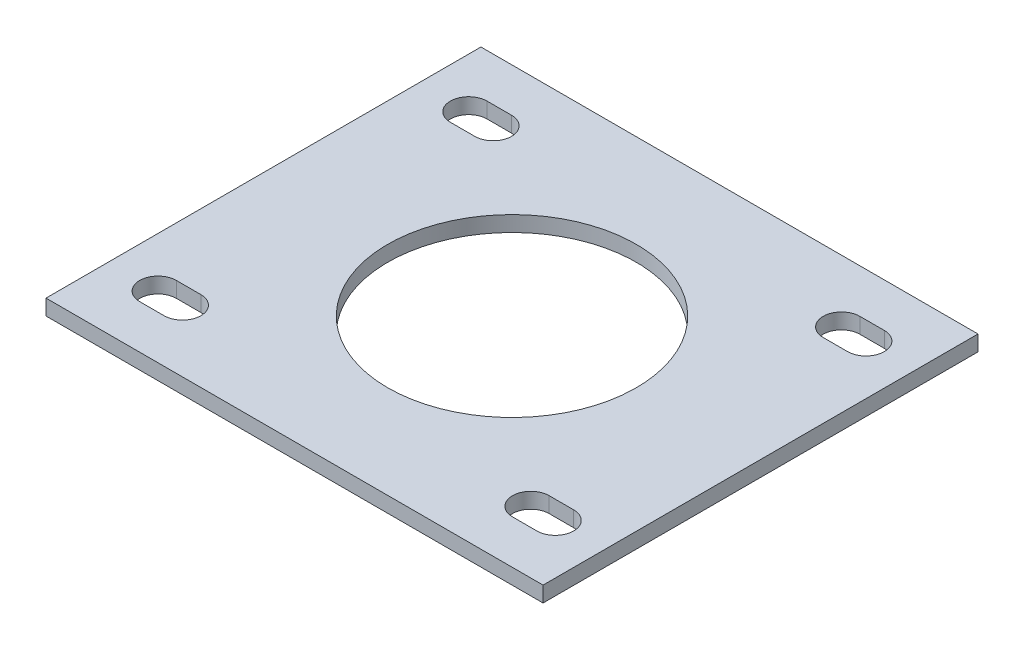
ISO-10303-21;
HEADER;
FILE_DESCRIPTION(('STEP AP214'),'2;1');
FILE_NAME('part.step','',(''),(''),'','','');
FILE_SCHEMA(('AUTOMOTIVE_DESIGN { 1 0 10303 214 1 1 1 1 }'));
ENDSEC;
DATA;
#1=APPLICATION_CONTEXT('core data for automotive mechanical design processes');
#2=APPLICATION_PROTOCOL_DEFINITION('international standard','automotive_design',2000,#1);
#3=PRODUCT_CONTEXT('',#1,'mechanical');
#4=PRODUCT('Part','Part','',(#3));
#5=PRODUCT_RELATED_PRODUCT_CATEGORY('part','',(#4));
#6=PRODUCT_DEFINITION_FORMATION('','',#4);
#7=PRODUCT_DEFINITION_CONTEXT('part definition',#1,'design');
#8=PRODUCT_DEFINITION('design','',#6,#7);
#9=PRODUCT_DEFINITION_SHAPE('','',#8);
#10=(LENGTH_UNIT() NAMED_UNIT(*) SI_UNIT(.MILLI.,.METRE.));
#11=(NAMED_UNIT(*) PLANE_ANGLE_UNIT() SI_UNIT($,.RADIAN.));
#12=(NAMED_UNIT(*) SI_UNIT($,.STERADIAN.) SOLID_ANGLE_UNIT());
#13=UNCERTAINTY_MEASURE_WITH_UNIT(LENGTH_MEASURE(1.E-05),#10,'distance_accuracy_value','');
#14=(GEOMETRIC_REPRESENTATION_CONTEXT(3) GLOBAL_UNCERTAINTY_ASSIGNED_CONTEXT((#13)) GLOBAL_UNIT_ASSIGNED_CONTEXT((#10,
#11,#12)) REPRESENTATION_CONTEXT('',''));
#15=CARTESIAN_POINT('',(0.,0.,0.));
#16=DIRECTION('',(0.,0.,1.));
#17=DIRECTION('',(1.,0.,0.));
#18=AXIS2_PLACEMENT_3D('',#15,#16,#17);
#19=CARTESIAN_POINT('',(0.,3.175,0.));
#20=DIRECTION('',(0.,1.,0.));
#21=DIRECTION('',(0.,0.,1.));
#22=AXIS2_PLACEMENT_3D('',#19,#20,#21);
#23=PLANE('',#22);
#24=CARTESIAN_POINT('',(-40.6,3.175,31.75));
#25=DIRECTION('',(0.,1.,0.));
#26=DIRECTION('',(0.,0.,1.));
#27=AXIS2_PLACEMENT_3D('',#24,#25,#26);
#28=CIRCLE('',#27,3.75);
#29=CARTESIAN_POINT('',(-40.6,3.175,28.));
#30=VERTEX_POINT('',#29);
#31=CARTESIAN_POINT('',(-40.6,3.175,35.5));
#32=VERTEX_POINT('',#31);
#33=EDGE_CURVE('E61',#30,#32,#28,.T.);
#34=ORIENTED_EDGE('',*,*,#33,.F.);
#35=DIRECTION('',(-1.,0.,0.));
#36=VECTOR('',#35,1.);
#37=CARTESIAN_POINT('',(-40.6,3.175,28.));
#38=LINE('',#37,#36);
#39=CARTESIAN_POINT('',(-35.6,3.175,28.));
#40=VERTEX_POINT('',#39);
#41=EDGE_CURVE('E246',#40,#30,#38,.T.);
#42=ORIENTED_EDGE('',*,*,#41,.F.);
#43=CARTESIAN_POINT('',(-35.6,3.175,31.75));
#44=DIRECTION('',(0.,1.,0.));
#45=DIRECTION('',(0.,0.,1.));
#46=AXIS2_PLACEMENT_3D('',#43,#44,#45);
#47=CIRCLE('',#46,3.75);
#48=CARTESIAN_POINT('',(-35.6,3.175,35.5));
#49=VERTEX_POINT('',#48);
#50=EDGE_CURVE('E250',#49,#40,#47,.T.);
#51=ORIENTED_EDGE('',*,*,#50,.F.);
#52=DIRECTION('',(1.,0.,0.));
#53=VECTOR('',#52,1.);
#54=CARTESIAN_POINT('',(-40.6,3.175,35.5));
#55=LINE('',#54,#53);
#56=EDGE_CURVE('E255',#32,#49,#55,.T.);
#57=ORIENTED_EDGE('',*,*,#56,.F.);
#58=EDGE_LOOP('',(#34,#42,#51,#57));
#59=FACE_BOUND('',#58,.T.);
#60=CARTESIAN_POINT('',(35.6,3.175,-31.75));
#61=DIRECTION('',(0.,1.,0.));
#62=DIRECTION('',(0.,0.,1.));
#63=AXIS2_PLACEMENT_3D('',#60,#61,#62);
#64=CIRCLE('',#63,3.75);
#65=CARTESIAN_POINT('',(35.6,3.175,-35.5));
#66=VERTEX_POINT('',#65);
#67=CARTESIAN_POINT('',(35.6,3.175,-28.));
#68=VERTEX_POINT('',#67);
#69=EDGE_CURVE('E69',#66,#68,#64,.T.);
#70=ORIENTED_EDGE('',*,*,#69,.F.);
#71=DIRECTION('',(-1.,0.,0.));
#72=VECTOR('',#71,1.);
#73=CARTESIAN_POINT('',(35.6,3.175,-35.5));
#74=LINE('',#73,#72);
#75=CARTESIAN_POINT('',(40.6,3.175,-35.5));
#76=VERTEX_POINT('',#75);
#77=EDGE_CURVE('E285',#76,#66,#74,.T.);
#78=ORIENTED_EDGE('',*,*,#77,.F.);
#79=CARTESIAN_POINT('',(40.6,3.175,-31.75));
#80=DIRECTION('',(0.,1.,0.));
#81=DIRECTION('',(0.,0.,1.));
#82=AXIS2_PLACEMENT_3D('',#79,#80,#81);
#83=CIRCLE('',#82,3.75);
#84=CARTESIAN_POINT('',(40.6,3.175,-28.));
#85=VERTEX_POINT('',#84);
#86=EDGE_CURVE('E289',#85,#76,#83,.T.);
#87=ORIENTED_EDGE('',*,*,#86,.F.);
#88=DIRECTION('',(1.,0.,0.));
#89=VECTOR('',#88,1.);
#90=CARTESIAN_POINT('',(35.6,3.175,-28.));
#91=LINE('',#90,#89);
#92=EDGE_CURVE('E294',#68,#85,#91,.T.);
#93=ORIENTED_EDGE('',*,*,#92,.F.);
#94=EDGE_LOOP('',(#70,#78,#87,#93));
#95=FACE_BOUND('',#94,.T.);
#96=CARTESIAN_POINT('',(35.6,3.175,31.75));
#97=DIRECTION('',(0.,1.,0.));
#98=DIRECTION('',(0.,0.,1.));
#99=AXIS2_PLACEMENT_3D('',#96,#97,#98);
#100=CIRCLE('',#99,3.75);
#101=CARTESIAN_POINT('',(35.6,3.175,28.));
#102=VERTEX_POINT('',#101);
#103=CARTESIAN_POINT('',(35.6,3.175,35.5));
#104=VERTEX_POINT('',#103);
#105=EDGE_CURVE('E186',#102,#104,#100,.T.);
#106=ORIENTED_EDGE('',*,*,#105,.F.);
#107=DIRECTION('',(-1.,0.,0.));
#108=VECTOR('',#107,1.);
#109=CARTESIAN_POINT('',(35.6,3.175,28.));
#110=LINE('',#109,#108);
#111=CARTESIAN_POINT('',(40.6,3.175,28.));
#112=VERTEX_POINT('',#111);
#113=EDGE_CURVE('E197',#112,#102,#110,.T.);
#114=ORIENTED_EDGE('',*,*,#113,.F.);
#115=CARTESIAN_POINT('',(40.6,3.175,31.75));
#116=DIRECTION('',(0.,1.,0.));
#117=DIRECTION('',(0.,0.,1.));
#118=AXIS2_PLACEMENT_3D('',#115,#116,#117);
#119=CIRCLE('',#118,3.75);
#120=CARTESIAN_POINT('',(40.6,3.175,35.5));
#121=VERTEX_POINT('',#120);
#122=EDGE_CURVE('E203',#121,#112,#119,.T.);
#123=ORIENTED_EDGE('',*,*,#122,.F.);
#124=DIRECTION('',(1.,0.,0.));
#125=VECTOR('',#124,1.);
#126=CARTESIAN_POINT('',(35.6,3.175,35.5));
#127=LINE('',#126,#125);
#128=EDGE_CURVE('E208',#104,#121,#127,.T.);
#129=ORIENTED_EDGE('',*,*,#128,.F.);
#130=EDGE_LOOP('',(#106,#114,#123,#129));
#131=FACE_BOUND('',#130,.T.);
#132=CARTESIAN_POINT('',(-40.6,3.175,-31.75));
#133=DIRECTION('',(0.,1.,0.));
#134=DIRECTION('',(0.,0.,1.));
#135=AXIS2_PLACEMENT_3D('',#132,#133,#134);
#136=CIRCLE('',#135,3.75000000000001);
#137=CARTESIAN_POINT('',(-40.6,3.175,-35.5));
#138=VERTEX_POINT('',#137);
#139=CARTESIAN_POINT('',(-40.6,3.175,-28.));
#140=VERTEX_POINT('',#139);
#141=EDGE_CURVE('E261',#138,#140,#136,.T.);
#142=ORIENTED_EDGE('',*,*,#141,.F.);
#143=DIRECTION('',(-1.,0.,0.));
#144=VECTOR('',#143,1.);
#145=CARTESIAN_POINT('',(-40.6,3.175,-35.5));
#146=LINE('',#145,#144);
#147=CARTESIAN_POINT('',(-35.6,3.175,-35.5));
#148=VERTEX_POINT('',#147);
#149=EDGE_CURVE('E319',#148,#138,#146,.T.);
#150=ORIENTED_EDGE('',*,*,#149,.F.);
#151=CARTESIAN_POINT('',(-35.6,3.175,-31.75));
#152=DIRECTION('',(0.,1.,0.));
#153=DIRECTION('',(0.,0.,1.));
#154=AXIS2_PLACEMENT_3D('',#151,#152,#153);
#155=CIRCLE('',#154,3.75000000000001);
#156=CARTESIAN_POINT('',(-35.6,3.175,-28.));
#157=VERTEX_POINT('',#156);
#158=EDGE_CURVE('E338',#157,#148,#155,.T.);
#159=ORIENTED_EDGE('',*,*,#158,.F.);
#160=DIRECTION('',(1.,0.,0.));
#161=VECTOR('',#160,1.);
#162=CARTESIAN_POINT('',(-40.6,3.175,-28.));
#163=LINE('',#162,#161);
#164=EDGE_CURVE('E334',#140,#157,#163,.T.);
#165=ORIENTED_EDGE('',*,*,#164,.F.);
#166=EDGE_LOOP('',(#142,#150,#159,#165));
#167=FACE_BOUND('',#166,.T.);
#168=DIRECTION('',(0.,0.,1.));
#169=VECTOR('',#168,1.);
#170=CARTESIAN_POINT('',(-50.8,3.175,44.45));
#171=LINE('',#170,#169);
#172=CARTESIAN_POINT('',(-50.8,3.175,-44.45));
#173=VERTEX_POINT('',#172);
#174=CARTESIAN_POINT('',(-50.8,3.175,44.45));
#175=VERTEX_POINT('',#174);
#176=EDGE_CURVE('E366',#173,#175,#171,.T.);
#177=ORIENTED_EDGE('',*,*,#176,.T.);
#178=DIRECTION('',(1.,0.,0.));
#179=VECTOR('',#178,1.);
#180=CARTESIAN_POINT('',(50.8,3.175,44.45));
#181=LINE('',#180,#179);
#182=CARTESIAN_POINT('',(50.8,3.175,44.45));
#183=VERTEX_POINT('',#182);
#184=EDGE_CURVE('E370',#175,#183,#181,.T.);
#185=ORIENTED_EDGE('',*,*,#184,.T.);
#186=DIRECTION('',(0.,0.,-1.));
#187=VECTOR('',#186,1.);
#188=CARTESIAN_POINT('',(50.8,3.175,44.45));
#189=LINE('',#188,#187);
#190=CARTESIAN_POINT('',(50.8,3.175,-44.45));
#191=VERTEX_POINT('',#190);
#192=EDGE_CURVE('E374',#183,#191,#189,.T.);
#193=ORIENTED_EDGE('',*,*,#192,.T.);
#194=DIRECTION('',(-1.,0.,0.));
#195=VECTOR('',#194,1.);
#196=CARTESIAN_POINT('',(50.8,3.175,-44.45));
#197=LINE('',#196,#195);
#198=EDGE_CURVE('E377',#191,#173,#197,.T.);
#199=ORIENTED_EDGE('',*,*,#198,.T.);
#200=EDGE_LOOP('',(#177,#185,#193,#199));
#201=FACE_BOUND('',#200,.T.);
#202=CARTESIAN_POINT('',(0.,3.175,0.));
#203=DIRECTION('',(0.,1.,0.));
#204=DIRECTION('',(0.,0.,1.));
#205=AXIS2_PLACEMENT_3D('',#202,#203,#204);
#206=CIRCLE('',#205,25.4);
#207=CARTESIAN_POINT('',(0.,3.175,25.4));
#208=VERTEX_POINT('',#207);
#209=EDGE_CURVE('E358',#208,#208,#206,.T.);
#210=ORIENTED_EDGE('',*,*,#209,.F.);
#211=EDGE_LOOP('',(#210));
#212=FACE_BOUND('',#211,.T.);
#213=ADVANCED_FACE('F45',(#59,#95,#131,#167,#201,#212),#23,.T.);
#214=CARTESIAN_POINT('',(0.,0.,0.));
#215=DIRECTION('',(0.,1.,0.));
#216=DIRECTION('',(0.,0.,1.));
#217=AXIS2_PLACEMENT_3D('',#214,#215,#216);
#218=PLANE('',#217);
#219=DIRECTION('',(-1.,0.,0.));
#220=VECTOR('',#219,1.);
#221=CARTESIAN_POINT('',(-40.6,0.,28.));
#222=LINE('',#221,#220);
#223=CARTESIAN_POINT('',(-35.6,0.,28.));
#224=VERTEX_POINT('',#223);
#225=CARTESIAN_POINT('',(-40.6,0.,28.));
#226=VERTEX_POINT('',#225);
#227=EDGE_CURVE('E236',#224,#226,#222,.T.);
#228=ORIENTED_EDGE('',*,*,#227,.T.);
#229=CARTESIAN_POINT('',(-40.6,0.,31.75));
#230=DIRECTION('',(0.,1.,0.));
#231=DIRECTION('',(0.,0.,1.));
#232=AXIS2_PLACEMENT_3D('',#229,#230,#231);
#233=CIRCLE('',#232,3.75);
#234=CARTESIAN_POINT('',(-40.6,0.,35.5));
#235=VERTEX_POINT('',#234);
#236=EDGE_CURVE('E251',#226,#235,#233,.T.);
#237=ORIENTED_EDGE('',*,*,#236,.T.);
#238=DIRECTION('',(1.,0.,0.));
#239=VECTOR('',#238,1.);
#240=CARTESIAN_POINT('',(-40.6,0.,35.5));
#241=LINE('',#240,#239);
#242=CARTESIAN_POINT('',(-35.6,0.,35.5));
#243=VERTEX_POINT('',#242);
#244=EDGE_CURVE('E269',#235,#243,#241,.T.);
#245=ORIENTED_EDGE('',*,*,#244,.T.);
#246=CARTESIAN_POINT('',(-35.6,0.,31.75));
#247=DIRECTION('',(0.,1.,0.));
#248=DIRECTION('',(0.,0.,1.));
#249=AXIS2_PLACEMENT_3D('',#246,#247,#248);
#250=CIRCLE('',#249,3.75);
#251=EDGE_CURVE('E265',#243,#224,#250,.T.);
#252=ORIENTED_EDGE('',*,*,#251,.T.);
#253=EDGE_LOOP('',(#228,#237,#245,#252));
#254=FACE_BOUND('',#253,.T.);
#255=DIRECTION('',(-1.,0.,0.));
#256=VECTOR('',#255,1.);
#257=CARTESIAN_POINT('',(35.6,0.,-35.5));
#258=LINE('',#257,#256);
#259=CARTESIAN_POINT('',(40.6,0.,-35.5));
#260=VERTEX_POINT('',#259);
#261=CARTESIAN_POINT('',(35.6,0.,-35.5));
#262=VERTEX_POINT('',#261);
#263=EDGE_CURVE('E279',#260,#262,#258,.T.);
#264=ORIENTED_EDGE('',*,*,#263,.T.);
#265=CARTESIAN_POINT('',(35.6,0.,-31.75));
#266=DIRECTION('',(0.,1.,0.));
#267=DIRECTION('',(0.,0.,1.));
#268=AXIS2_PLACEMENT_3D('',#265,#266,#267);
#269=CIRCLE('',#268,3.75);
#270=CARTESIAN_POINT('',(35.6,0.,-28.));
#271=VERTEX_POINT('',#270);
#272=EDGE_CURVE('E290',#262,#271,#269,.T.);
#273=ORIENTED_EDGE('',*,*,#272,.T.);
#274=DIRECTION('',(1.,0.,0.));
#275=VECTOR('',#274,1.);
#276=CARTESIAN_POINT('',(35.6,0.,-28.));
#277=LINE('',#276,#275);
#278=CARTESIAN_POINT('',(40.6,0.,-28.));
#279=VERTEX_POINT('',#278);
#280=EDGE_CURVE('E307',#271,#279,#277,.T.);
#281=ORIENTED_EDGE('',*,*,#280,.T.);
#282=CARTESIAN_POINT('',(40.6,0.,-31.75));
#283=DIRECTION('',(0.,1.,0.));
#284=DIRECTION('',(0.,0.,1.));
#285=AXIS2_PLACEMENT_3D('',#282,#283,#284);
#286=CIRCLE('',#285,3.75);
#287=EDGE_CURVE('E303',#279,#260,#286,.T.);
#288=ORIENTED_EDGE('',*,*,#287,.T.);
#289=EDGE_LOOP('',(#264,#273,#281,#288));
#290=FACE_BOUND('',#289,.T.);
#291=DIRECTION('',(-1.,0.,0.));
#292=VECTOR('',#291,1.);
#293=CARTESIAN_POINT('',(35.6,0.,28.));
#294=LINE('',#293,#292);
#295=CARTESIAN_POINT('',(40.6,0.,28.));
#296=VERTEX_POINT('',#295);
#297=CARTESIAN_POINT('',(35.6,0.,28.));
#298=VERTEX_POINT('',#297);
#299=EDGE_CURVE('E219',#296,#298,#294,.T.);
#300=ORIENTED_EDGE('',*,*,#299,.T.);
#301=CARTESIAN_POINT('',(35.6,0.,31.75));
#302=DIRECTION('',(0.,1.,0.));
#303=DIRECTION('',(0.,0.,1.));
#304=AXIS2_PLACEMENT_3D('',#301,#302,#303);
#305=CIRCLE('',#304,3.75);
#306=CARTESIAN_POINT('',(35.6,0.,35.5));
#307=VERTEX_POINT('',#306);
#308=EDGE_CURVE('E189',#298,#307,#305,.T.);
#309=ORIENTED_EDGE('',*,*,#308,.T.);
#310=DIRECTION('',(1.,0.,0.));
#311=VECTOR('',#310,1.);
#312=CARTESIAN_POINT('',(35.6,0.,35.5));
#313=LINE('',#312,#311);
#314=CARTESIAN_POINT('',(40.6,0.,35.5));
#315=VERTEX_POINT('',#314);
#316=EDGE_CURVE('E227',#307,#315,#313,.T.);
#317=ORIENTED_EDGE('',*,*,#316,.T.);
#318=CARTESIAN_POINT('',(40.6,0.,31.75));
#319=DIRECTION('',(0.,1.,0.));
#320=DIRECTION('',(0.,0.,1.));
#321=AXIS2_PLACEMENT_3D('',#318,#319,#320);
#322=CIRCLE('',#321,3.75);
#323=EDGE_CURVE('E222',#315,#296,#322,.T.);
#324=ORIENTED_EDGE('',*,*,#323,.T.);
#325=EDGE_LOOP('',(#300,#309,#317,#324));
#326=FACE_BOUND('',#325,.T.);
#327=DIRECTION('',(-1.,0.,0.));
#328=VECTOR('',#327,1.);
#329=CARTESIAN_POINT('',(-40.6,0.,-35.5));
#330=LINE('',#329,#328);
#331=CARTESIAN_POINT('',(-35.6,0.,-35.5));
#332=VERTEX_POINT('',#331);
#333=CARTESIAN_POINT('',(-40.6,0.,-35.5));
#334=VERTEX_POINT('',#333);
#335=EDGE_CURVE('E327',#332,#334,#330,.T.);
#336=ORIENTED_EDGE('',*,*,#335,.T.);
#337=CARTESIAN_POINT('',(-40.6,0.,-31.75));
#338=DIRECTION('',(0.,1.,0.));
#339=DIRECTION('',(0.,0.,1.));
#340=AXIS2_PLACEMENT_3D('',#337,#338,#339);
#341=CIRCLE('',#340,3.75000000000001);
#342=CARTESIAN_POINT('',(-40.6,0.,-28.));
#343=VERTEX_POINT('',#342);
#344=EDGE_CURVE('E314',#334,#343,#341,.T.);
#345=ORIENTED_EDGE('',*,*,#344,.T.);
#346=DIRECTION('',(1.,0.,0.));
#347=VECTOR('',#346,1.);
#348=CARTESIAN_POINT('',(-40.6,0.,-28.));
#349=LINE('',#348,#347);
#350=CARTESIAN_POINT('',(-35.6,0.,-28.));
#351=VERTEX_POINT('',#350);
#352=EDGE_CURVE('E318',#343,#351,#349,.T.);
#353=ORIENTED_EDGE('',*,*,#352,.T.);
#354=CARTESIAN_POINT('',(-35.6,0.,-31.75));
#355=DIRECTION('',(0.,1.,0.));
#356=DIRECTION('',(0.,0.,1.));
#357=AXIS2_PLACEMENT_3D('',#354,#355,#356);
#358=CIRCLE('',#357,3.75000000000001);
#359=EDGE_CURVE('E323',#351,#332,#358,.T.);
#360=ORIENTED_EDGE('',*,*,#359,.T.);
#361=EDGE_LOOP('',(#336,#345,#353,#360));
#362=FACE_BOUND('',#361,.T.);
#363=DIRECTION('',(0.,0.,1.));
#364=VECTOR('',#363,1.);
#365=CARTESIAN_POINT('',(-50.8,0.,44.45));
#366=LINE('',#365,#364);
#367=CARTESIAN_POINT('',(-50.8,0.,-44.45));
#368=VERTEX_POINT('',#367);
#369=CARTESIAN_POINT('',(-50.8,0.,44.45));
#370=VERTEX_POINT('',#369);
#371=EDGE_CURVE('E362',#368,#370,#366,.T.);
#372=ORIENTED_EDGE('',*,*,#371,.F.);
#373=DIRECTION('',(-1.,0.,0.));
#374=VECTOR('',#373,1.);
#375=CARTESIAN_POINT('',(50.8,0.,-44.45));
#376=LINE('',#375,#374);
#377=CARTESIAN_POINT('',(50.8,0.,-44.45));
#378=VERTEX_POINT('',#377);
#379=EDGE_CURVE('E371',#378,#368,#376,.T.);
#380=ORIENTED_EDGE('',*,*,#379,.F.);
#381=DIRECTION('',(0.,0.,-1.));
#382=VECTOR('',#381,1.);
#383=CARTESIAN_POINT('',(50.8,0.,44.45));
#384=LINE('',#383,#382);
#385=CARTESIAN_POINT('',(50.8,0.,44.45));
#386=VERTEX_POINT('',#385);
#387=EDGE_CURVE('E387',#386,#378,#384,.T.);
#388=ORIENTED_EDGE('',*,*,#387,.F.);
#389=DIRECTION('',(1.,0.,0.));
#390=VECTOR('',#389,1.);
#391=CARTESIAN_POINT('',(50.8,0.,44.45));
#392=LINE('',#391,#390);
#393=EDGE_CURVE('E384',#370,#386,#392,.T.);
#394=ORIENTED_EDGE('',*,*,#393,.F.);
#395=EDGE_LOOP('',(#372,#380,#388,#394));
#396=FACE_BOUND('',#395,.T.);
#397=CARTESIAN_POINT('',(0.,0.,0.));
#398=DIRECTION('',(0.,1.,0.));
#399=DIRECTION('',(0.,0.,1.));
#400=AXIS2_PLACEMENT_3D('',#397,#398,#399);
#401=CIRCLE('',#400,25.4);
#402=CARTESIAN_POINT('',(0.,0.,25.4));
#403=VERTEX_POINT('',#402);
#404=EDGE_CURVE('E348',#403,#403,#401,.T.);
#405=ORIENTED_EDGE('',*,*,#404,.T.);
#406=EDGE_LOOP('',(#405));
#407=FACE_BOUND('',#406,.T.);
#408=ADVANCED_FACE('F410',(#254,#290,#326,#362,#396,#407),#218,.F.);
#409=CARTESIAN_POINT('',(-50.8,3.175,44.45));
#410=DIRECTION('',(1.,0.,0.));
#411=DIRECTION('',(0.,0.,-1.));
#412=AXIS2_PLACEMENT_3D('',#409,#410,#411);
#413=PLANE('',#412);
#414=ORIENTED_EDGE('',*,*,#371,.T.);
#415=DIRECTION('',(0.,-1.,0.));
#416=VECTOR('',#415,1.);
#417=CARTESIAN_POINT('',(-50.8,3.175,44.45));
#418=LINE('',#417,#416);
#419=EDGE_CURVE('E11',#175,#370,#418,.T.);
#420=ORIENTED_EDGE('',*,*,#419,.F.);
#421=ORIENTED_EDGE('',*,*,#176,.F.);
#422=DIRECTION('',(0.,-1.,0.));
#423=VECTOR('',#422,1.);
#424=CARTESIAN_POINT('',(-50.8,3.175,-44.45));
#425=LINE('',#424,#423);
#426=EDGE_CURVE('E380',#173,#368,#425,.T.);
#427=ORIENTED_EDGE('',*,*,#426,.T.);
#428=EDGE_LOOP('',(#414,#420,#421,#427));
#429=FACE_BOUND('',#428,.T.);
#430=ADVANCED_FACE('F47',(#429),#413,.F.);
#431=CARTESIAN_POINT('',(50.8,3.175,44.45));
#432=DIRECTION('',(0.,0.,-1.));
#433=DIRECTION('',(-1.,0.,0.));
#434=AXIS2_PLACEMENT_3D('',#431,#432,#433);
#435=PLANE('',#434);
#436=ORIENTED_EDGE('',*,*,#393,.T.);
#437=DIRECTION('',(0.,-1.,0.));
#438=VECTOR('',#437,1.);
#439=CARTESIAN_POINT('',(50.8,3.175,44.45));
#440=LINE('',#439,#438);
#441=EDGE_CURVE('E54',#183,#386,#440,.T.);
#442=ORIENTED_EDGE('',*,*,#441,.F.);
#443=ORIENTED_EDGE('',*,*,#184,.F.);
#444=ORIENTED_EDGE('',*,*,#419,.T.);
#445=EDGE_LOOP('',(#436,#442,#443,#444));
#446=FACE_BOUND('',#445,.T.);
#447=ADVANCED_FACE('F421',(#446),#435,.F.);
#448=CARTESIAN_POINT('',(50.8,3.175,44.45));
#449=DIRECTION('',(-1.,0.,0.));
#450=DIRECTION('',(0.,0.,1.));
#451=AXIS2_PLACEMENT_3D('',#448,#449,#450);
#452=PLANE('',#451);
#453=ORIENTED_EDGE('',*,*,#387,.T.);
#454=DIRECTION('',(0.,-1.,0.));
#455=VECTOR('',#454,1.);
#456=CARTESIAN_POINT('',(50.8,3.175,-44.45));
#457=LINE('',#456,#455);
#458=EDGE_CURVE('E395',#191,#378,#457,.T.);
#459=ORIENTED_EDGE('',*,*,#458,.F.);
#460=ORIENTED_EDGE('',*,*,#192,.F.);
#461=ORIENTED_EDGE('',*,*,#441,.T.);
#462=EDGE_LOOP('',(#453,#459,#460,#461));
#463=FACE_BOUND('',#462,.T.);
#464=ADVANCED_FACE('F404',(#463),#452,.F.);
#465=CARTESIAN_POINT('',(50.8,3.175,-44.45));
#466=DIRECTION('',(0.,0.,1.));
#467=DIRECTION('',(1.,0.,0.));
#468=AXIS2_PLACEMENT_3D('',#465,#466,#467);
#469=PLANE('',#468);
#470=ORIENTED_EDGE('',*,*,#379,.T.);
#471=ORIENTED_EDGE('',*,*,#426,.F.);
#472=ORIENTED_EDGE('',*,*,#198,.F.);
#473=ORIENTED_EDGE('',*,*,#458,.T.);
#474=EDGE_LOOP('',(#470,#471,#472,#473));
#475=FACE_BOUND('',#474,.T.);
#476=ADVANCED_FACE('F414',(#475),#469,.F.);
#477=CARTESIAN_POINT('',(0.,3.175,0.));
#478=DIRECTION('',(0.,-1.,0.));
#479=DIRECTION('',(0.,0.,-1.));
#480=AXIS2_PLACEMENT_3D('',#477,#478,#479);
#481=CYLINDRICAL_SURFACE('',#480,25.4);
#482=ORIENTED_EDGE('',*,*,#209,.T.);
#483=EDGE_LOOP('',(#482));
#484=FACE_BOUND('',#483,.T.);
#485=ORIENTED_EDGE('',*,*,#404,.F.);
#486=EDGE_LOOP('',(#485));
#487=FACE_BOUND('',#486,.T.);
#488=ADVANCED_FACE('F439',(#484,#487),#481,.F.);
#489=CARTESIAN_POINT('',(-40.6,0.,-31.75));
#490=DIRECTION('',(0.,1.,0.));
#491=DIRECTION('',(0.,0.,1.));
#492=AXIS2_PLACEMENT_3D('',#489,#490,#491);
#493=CYLINDRICAL_SURFACE('',#492,3.75000000000001);
#494=ORIENTED_EDGE('',*,*,#141,.T.);
#495=DIRECTION('',(0.,1.,0.));
#496=VECTOR('',#495,1.);
#497=CARTESIAN_POINT('',(-40.6,0.,-28.));
#498=LINE('',#497,#496);
#499=EDGE_CURVE('E331',#343,#140,#498,.T.);
#500=ORIENTED_EDGE('',*,*,#499,.F.);
#501=ORIENTED_EDGE('',*,*,#344,.F.);
#502=DIRECTION('',(0.,1.,0.));
#503=VECTOR('',#502,1.);
#504=CARTESIAN_POINT('',(-40.6,0.,-35.5));
#505=LINE('',#504,#503);
#506=EDGE_CURVE('E345',#334,#138,#505,.T.);
#507=ORIENTED_EDGE('',*,*,#506,.T.);
#508=EDGE_LOOP('',(#494,#500,#501,#507));
#509=FACE_BOUND('',#508,.T.);
#510=ADVANCED_FACE('F445',(#509),#493,.F.);
#511=CARTESIAN_POINT('',(-40.6,0.,-35.5));
#512=DIRECTION('',(0.,0.,-1.));
#513=DIRECTION('',(-1.,0.,0.));
#514=AXIS2_PLACEMENT_3D('',#511,#512,#513);
#515=PLANE('',#514);
#516=ORIENTED_EDGE('',*,*,#149,.T.);
#517=ORIENTED_EDGE('',*,*,#506,.F.);
#518=ORIENTED_EDGE('',*,*,#335,.F.);
#519=DIRECTION('',(0.,1.,0.));
#520=VECTOR('',#519,1.);
#521=CARTESIAN_POINT('',(-35.6,0.,-35.5));
#522=LINE('',#521,#520);
#523=EDGE_CURVE('E349',#332,#148,#522,.T.);
#524=ORIENTED_EDGE('',*,*,#523,.T.);
#525=EDGE_LOOP('',(#516,#517,#518,#524));
#526=FACE_BOUND('',#525,.T.);
#527=ADVANCED_FACE('F450',(#526),#515,.F.);
#528=CARTESIAN_POINT('',(-35.6,0.,-31.75));
#529=DIRECTION('',(0.,1.,0.));
#530=DIRECTION('',(0.,0.,1.));
#531=AXIS2_PLACEMENT_3D('',#528,#529,#530);
#532=CYLINDRICAL_SURFACE('',#531,3.75000000000001);
#533=ORIENTED_EDGE('',*,*,#158,.T.);
#534=ORIENTED_EDGE('',*,*,#523,.F.);
#535=ORIENTED_EDGE('',*,*,#359,.F.);
#536=DIRECTION('',(0.,1.,0.));
#537=VECTOR('',#536,1.);
#538=CARTESIAN_POINT('',(-35.6,0.,-28.));
#539=LINE('',#538,#537);
#540=EDGE_CURVE('E352',#351,#157,#539,.T.);
#541=ORIENTED_EDGE('',*,*,#540,.T.);
#542=EDGE_LOOP('',(#533,#534,#535,#541));
#543=FACE_BOUND('',#542,.T.);
#544=ADVANCED_FACE('F458',(#543),#532,.F.);
#545=CARTESIAN_POINT('',(-40.6,0.,-28.));
#546=DIRECTION('',(0.,0.,1.));
#547=DIRECTION('',(1.,0.,0.));
#548=AXIS2_PLACEMENT_3D('',#545,#546,#547);
#549=PLANE('',#548);
#550=ORIENTED_EDGE('',*,*,#164,.T.);
#551=ORIENTED_EDGE('',*,*,#540,.F.);
#552=ORIENTED_EDGE('',*,*,#352,.F.);
#553=ORIENTED_EDGE('',*,*,#499,.T.);
#554=EDGE_LOOP('',(#550,#551,#552,#553));
#555=FACE_BOUND('',#554,.T.);
#556=ADVANCED_FACE('F462',(#555),#549,.F.);
#557=CARTESIAN_POINT('',(35.6,0.,31.75));
#558=DIRECTION('',(0.,1.,0.));
#559=DIRECTION('',(0.,0.,1.));
#560=AXIS2_PLACEMENT_3D('',#557,#558,#559);
#561=CYLINDRICAL_SURFACE('',#560,3.75);
#562=ORIENTED_EDGE('',*,*,#105,.T.);
#563=DIRECTION('',(0.,1.,0.));
#564=VECTOR('',#563,1.);
#565=CARTESIAN_POINT('',(35.6,0.,35.5));
#566=LINE('',#565,#564);
#567=EDGE_CURVE('E223',#307,#104,#566,.T.);
#568=ORIENTED_EDGE('',*,*,#567,.F.);
#569=ORIENTED_EDGE('',*,*,#308,.F.);
#570=DIRECTION('',(0.,1.,0.));
#571=VECTOR('',#570,1.);
#572=CARTESIAN_POINT('',(35.6,0.,28.));
#573=LINE('',#572,#571);
#574=EDGE_CURVE('E182',#298,#102,#573,.T.);
#575=ORIENTED_EDGE('',*,*,#574,.T.);
#576=EDGE_LOOP('',(#562,#568,#569,#575));
#577=FACE_BOUND('',#576,.T.);
#578=ADVANCED_FACE('F184',(#577),#561,.F.);
#579=CARTESIAN_POINT('',(35.6,0.,28.));
#580=DIRECTION('',(0.,0.,-1.));
#581=DIRECTION('',(-1.,0.,0.));
#582=AXIS2_PLACEMENT_3D('',#579,#580,#581);
#583=PLANE('',#582);
#584=ORIENTED_EDGE('',*,*,#113,.T.);
#585=ORIENTED_EDGE('',*,*,#574,.F.);
#586=ORIENTED_EDGE('',*,*,#299,.F.);
#587=DIRECTION('',(0.,1.,0.));
#588=VECTOR('',#587,1.);
#589=CARTESIAN_POINT('',(40.6,0.,28.));
#590=LINE('',#589,#588);
#591=EDGE_CURVE('E194',#296,#112,#590,.T.);
#592=ORIENTED_EDGE('',*,*,#591,.T.);
#593=EDGE_LOOP('',(#584,#585,#586,#592));
#594=FACE_BOUND('',#593,.T.);
#595=ADVANCED_FACE('F198',(#594),#583,.F.);
#596=CARTESIAN_POINT('',(40.6,0.,31.75));
#597=DIRECTION('',(0.,1.,0.));
#598=DIRECTION('',(0.,0.,1.));
#599=AXIS2_PLACEMENT_3D('',#596,#597,#598);
#600=CYLINDRICAL_SURFACE('',#599,3.75);
#601=ORIENTED_EDGE('',*,*,#122,.T.);
#602=ORIENTED_EDGE('',*,*,#591,.F.);
#603=ORIENTED_EDGE('',*,*,#323,.F.);
#604=DIRECTION('',(0.,1.,0.));
#605=VECTOR('',#604,1.);
#606=CARTESIAN_POINT('',(40.6,0.,35.5));
#607=LINE('',#606,#605);
#608=EDGE_CURVE('E640',#315,#121,#607,.T.);
#609=ORIENTED_EDGE('',*,*,#608,.T.);
#610=EDGE_LOOP('',(#601,#602,#603,#609));
#611=FACE_BOUND('',#610,.T.);
#612=ADVANCED_FACE('F502',(#611),#600,.F.);
#613=CARTESIAN_POINT('',(35.6,0.,35.5));
#614=DIRECTION('',(0.,0.,1.));
#615=DIRECTION('',(1.,0.,0.));
#616=AXIS2_PLACEMENT_3D('',#613,#614,#615);
#617=PLANE('',#616);
#618=ORIENTED_EDGE('',*,*,#128,.T.);
#619=ORIENTED_EDGE('',*,*,#608,.F.);
#620=ORIENTED_EDGE('',*,*,#316,.F.);
#621=ORIENTED_EDGE('',*,*,#567,.T.);
#622=EDGE_LOOP('',(#618,#619,#620,#621));
#623=FACE_BOUND('',#622,.T.);
#624=ADVANCED_FACE('F485',(#623),#617,.F.);
#625=CARTESIAN_POINT('',(35.6,0.,-31.75));
#626=DIRECTION('',(0.,1.,0.));
#627=DIRECTION('',(0.,0.,1.));
#628=AXIS2_PLACEMENT_3D('',#625,#626,#627);
#629=CYLINDRICAL_SURFACE('',#628,3.75);
#630=ORIENTED_EDGE('',*,*,#69,.T.);
#631=DIRECTION('',(0.,1.,0.));
#632=VECTOR('',#631,1.);
#633=CARTESIAN_POINT('',(35.6,0.,-28.));
#634=LINE('',#633,#632);
#635=EDGE_CURVE('E276',#271,#68,#634,.T.);
#636=ORIENTED_EDGE('',*,*,#635,.F.);
#637=ORIENTED_EDGE('',*,*,#272,.F.);
#638=DIRECTION('',(0.,1.,0.));
#639=VECTOR('',#638,1.);
#640=CARTESIAN_POINT('',(35.6,0.,-35.5));
#641=LINE('',#640,#639);
#642=EDGE_CURVE('E210',#262,#66,#641,.T.);
#643=ORIENTED_EDGE('',*,*,#642,.T.);
#644=EDGE_LOOP('',(#630,#636,#637,#643));
#645=FACE_BOUND('',#644,.T.);
#646=ADVANCED_FACE('F473',(#645),#629,.F.);
#647=CARTESIAN_POINT('',(35.6,0.,-35.5));
#648=DIRECTION('',(0.,0.,-1.));
#649=DIRECTION('',(-1.,0.,0.));
#650=AXIS2_PLACEMENT_3D('',#647,#648,#649);
#651=PLANE('',#650);
#652=ORIENTED_EDGE('',*,*,#77,.T.);
#653=ORIENTED_EDGE('',*,*,#642,.F.);
#654=ORIENTED_EDGE('',*,*,#263,.F.);
#655=DIRECTION('',(0.,1.,0.));
#656=VECTOR('',#655,1.);
#657=CARTESIAN_POINT('',(40.6,0.,-35.5));
#658=LINE('',#657,#656);
#659=EDGE_CURVE('E214',#260,#76,#658,.T.);
#660=ORIENTED_EDGE('',*,*,#659,.T.);
#661=EDGE_LOOP('',(#652,#653,#654,#660));
#662=FACE_BOUND('',#661,.T.);
#663=ADVANCED_FACE('F469',(#662),#651,.F.);
#664=CARTESIAN_POINT('',(40.6,0.,-31.75));
#665=DIRECTION('',(0.,1.,0.));
#666=DIRECTION('',(0.,0.,1.));
#667=AXIS2_PLACEMENT_3D('',#664,#665,#666);
#668=CYLINDRICAL_SURFACE('',#667,3.75);
#669=ORIENTED_EDGE('',*,*,#86,.T.);
#670=ORIENTED_EDGE('',*,*,#659,.F.);
#671=ORIENTED_EDGE('',*,*,#287,.F.);
#672=DIRECTION('',(0.,1.,0.));
#673=VECTOR('',#672,1.);
#674=CARTESIAN_POINT('',(40.6,0.,-28.));
#675=LINE('',#674,#673);
#676=EDGE_CURVE('E280',#279,#85,#675,.T.);
#677=ORIENTED_EDGE('',*,*,#676,.T.);
#678=EDGE_LOOP('',(#669,#670,#671,#677));
#679=FACE_BOUND('',#678,.T.);
#680=ADVANCED_FACE('F472',(#679),#668,.F.);
#681=CARTESIAN_POINT('',(35.6,0.,-28.));
#682=DIRECTION('',(0.,0.,1.));
#683=DIRECTION('',(1.,0.,0.));
#684=AXIS2_PLACEMENT_3D('',#681,#682,#683);
#685=PLANE('',#684);
#686=ORIENTED_EDGE('',*,*,#92,.T.);
#687=ORIENTED_EDGE('',*,*,#676,.F.);
#688=ORIENTED_EDGE('',*,*,#280,.F.);
#689=ORIENTED_EDGE('',*,*,#635,.T.);
#690=EDGE_LOOP('',(#686,#687,#688,#689));
#691=FACE_BOUND('',#690,.T.);
#692=ADVANCED_FACE('F477',(#691),#685,.F.);
#693=CARTESIAN_POINT('',(-40.6,0.,31.75));
#694=DIRECTION('',(0.,1.,0.));
#695=DIRECTION('',(0.,0.,1.));
#696=AXIS2_PLACEMENT_3D('',#693,#694,#695);
#697=CYLINDRICAL_SURFACE('',#696,3.75);
#698=ORIENTED_EDGE('',*,*,#33,.T.);
#699=DIRECTION('',(0.,1.,0.));
#700=VECTOR('',#699,1.);
#701=CARTESIAN_POINT('',(-40.6,0.,35.5));
#702=LINE('',#701,#700);
#703=EDGE_CURVE('E233',#235,#32,#702,.T.);
#704=ORIENTED_EDGE('',*,*,#703,.F.);
#705=ORIENTED_EDGE('',*,*,#236,.F.);
#706=DIRECTION('',(0.,1.,0.));
#707=VECTOR('',#706,1.);
#708=CARTESIAN_POINT('',(-40.6,0.,28.));
#709=LINE('',#708,#707);
#710=EDGE_CURVE('E243',#226,#30,#709,.T.);
#711=ORIENTED_EDGE('',*,*,#710,.T.);
#712=EDGE_LOOP('',(#698,#704,#705,#711));
#713=FACE_BOUND('',#712,.T.);
#714=ADVANCED_FACE('F481',(#713),#697,.F.);
#715=CARTESIAN_POINT('',(-40.6,0.,28.));
#716=DIRECTION('',(0.,0.,-1.));
#717=DIRECTION('',(-1.,0.,0.));
#718=AXIS2_PLACEMENT_3D('',#715,#716,#717);
#719=PLANE('',#718);
#720=ORIENTED_EDGE('',*,*,#41,.T.);
#721=ORIENTED_EDGE('',*,*,#710,.F.);
#722=ORIENTED_EDGE('',*,*,#227,.F.);
#723=DIRECTION('',(0.,1.,0.));
#724=VECTOR('',#723,1.);
#725=CARTESIAN_POINT('',(-35.6,0.,28.));
#726=LINE('',#725,#724);
#727=EDGE_CURVE('E240',#224,#40,#726,.T.);
#728=ORIENTED_EDGE('',*,*,#727,.T.);
#729=EDGE_LOOP('',(#720,#721,#722,#728));
#730=FACE_BOUND('',#729,.T.);
#731=ADVANCED_FACE('F486',(#730),#719,.F.);
#732=CARTESIAN_POINT('',(-35.6,0.,31.75));
#733=DIRECTION('',(0.,1.,0.));
#734=DIRECTION('',(0.,0.,1.));
#735=AXIS2_PLACEMENT_3D('',#732,#733,#734);
#736=CYLINDRICAL_SURFACE('',#735,3.75);
#737=ORIENTED_EDGE('',*,*,#50,.T.);
#738=ORIENTED_EDGE('',*,*,#727,.F.);
#739=ORIENTED_EDGE('',*,*,#251,.F.);
#740=DIRECTION('',(0.,1.,0.));
#741=VECTOR('',#740,1.);
#742=CARTESIAN_POINT('',(-35.6,0.,35.5));
#743=LINE('',#742,#741);
#744=EDGE_CURVE('E237',#243,#49,#743,.T.);
#745=ORIENTED_EDGE('',*,*,#744,.T.);
#746=EDGE_LOOP('',(#737,#738,#739,#745));
#747=FACE_BOUND('',#746,.T.);
#748=ADVANCED_FACE('F489',(#747),#736,.F.);
#749=CARTESIAN_POINT('',(-40.6,0.,35.5));
#750=DIRECTION('',(0.,0.,1.));
#751=DIRECTION('',(1.,0.,0.));
#752=AXIS2_PLACEMENT_3D('',#749,#750,#751);
#753=PLANE('',#752);
#754=ORIENTED_EDGE('',*,*,#56,.T.);
#755=ORIENTED_EDGE('',*,*,#744,.F.);
#756=ORIENTED_EDGE('',*,*,#244,.F.);
#757=ORIENTED_EDGE('',*,*,#703,.T.);
#758=EDGE_LOOP('',(#754,#755,#756,#757));
#759=FACE_BOUND('',#758,.T.);
#760=ADVANCED_FACE('F493',(#759),#753,.F.);
#761=CLOSED_SHELL('',(#213,#408,#430,#447,#464,#476,#488,#510,#527,#544,#556,#578,#595,#612,
#624,#646,#663,#680,#692,#714,#731,#748,#760));
#762=MANIFOLD_SOLID_BREP('B2',#761);
#763=ADVANCED_BREP_SHAPE_REPRESENTATION('',(#18,#762),#14);
#764=SHAPE_DEFINITION_REPRESENTATION(#9,#763);
ENDSEC;
END-ISO-10303-21;
